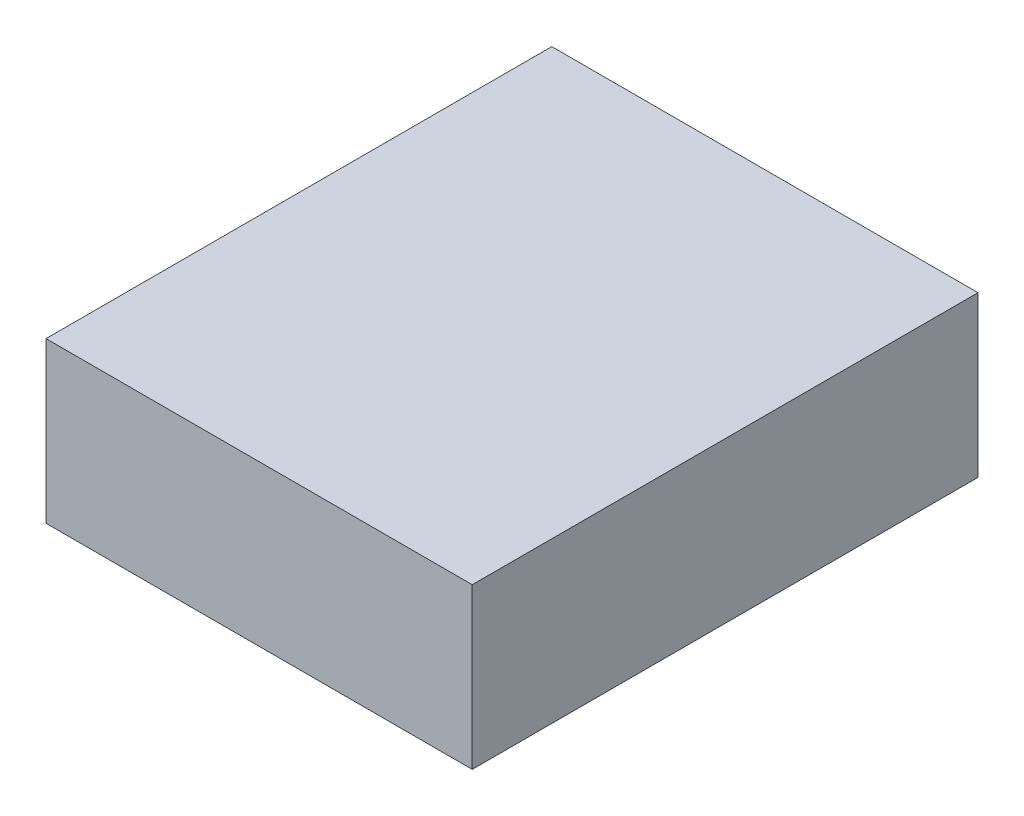
ISO-10303-21;
HEADER;
FILE_DESCRIPTION(('STEP AP214'),'2;1');
FILE_NAME('part.step','',(''),(''),'','','');
FILE_SCHEMA(('AUTOMOTIVE_DESIGN { 1 0 10303 214 1 1 1 1 }'));
ENDSEC;
DATA;
#1=APPLICATION_CONTEXT('core data for automotive mechanical design processes');
#2=APPLICATION_PROTOCOL_DEFINITION('international standard','automotive_design',2000,#1);
#3=PRODUCT_CONTEXT('',#1,'mechanical');
#4=PRODUCT('Part','Part','',(#3));
#5=PRODUCT_RELATED_PRODUCT_CATEGORY('part','',(#4));
#6=PRODUCT_DEFINITION_FORMATION('','',#4);
#7=PRODUCT_DEFINITION_CONTEXT('part definition',#1,'design');
#8=PRODUCT_DEFINITION('design','',#6,#7);
#9=PRODUCT_DEFINITION_SHAPE('','',#8);
#10=(LENGTH_UNIT() NAMED_UNIT(*) SI_UNIT(.MILLI.,.METRE.));
#11=(NAMED_UNIT(*) PLANE_ANGLE_UNIT() SI_UNIT($,.RADIAN.));
#12=(NAMED_UNIT(*) SI_UNIT($,.STERADIAN.) SOLID_ANGLE_UNIT());
#13=UNCERTAINTY_MEASURE_WITH_UNIT(LENGTH_MEASURE(1.E-05),#10,'distance_accuracy_value','');
#14=(GEOMETRIC_REPRESENTATION_CONTEXT(3) GLOBAL_UNCERTAINTY_ASSIGNED_CONTEXT((#13)) GLOBAL_UNIT_ASSIGNED_CONTEXT((#10,
#11,#12)) REPRESENTATION_CONTEXT('',''));
#15=CARTESIAN_POINT('',(0.,0.,0.));
#16=DIRECTION('',(0.,0.,1.));
#17=DIRECTION('',(1.,0.,0.));
#18=AXIS2_PLACEMENT_3D('',#15,#16,#17);
#19=CARTESIAN_POINT('',(-10.4778240280723,-10.,-16.4004969815323));
#20=DIRECTION('',(-1.,0.,0.));
#21=DIRECTION('',(0.,0.,1.));
#22=AXIS2_PLACEMENT_3D('',#19,#20,#21);
#23=PLANE('',#22);
#24=DIRECTION('',(0.,0.,1.));
#25=VECTOR('',#24,1.);
#26=CARTESIAN_POINT('',(-10.4778240280723,0.,-16.4004969815323));
#27=LINE('',#26,#25);
#28=CARTESIAN_POINT('',(-10.4778240280723,0.,-16.4004969815323));
#29=VERTEX_POINT('',#28);
#30=CARTESIAN_POINT('',(-10.4778240280723,0.,15.2189550735784));
#31=VERTEX_POINT('',#30);
#32=EDGE_CURVE('E98',#29,#31,#27,.T.);
#33=ORIENTED_EDGE('',*,*,#32,.F.);
#34=DIRECTION('',(0.,1.,0.));
#35=VECTOR('',#34,1.);
#36=CARTESIAN_POINT('',(-10.4778240280723,-10.,-16.4004969815323));
#37=LINE('',#36,#35);
#38=CARTESIAN_POINT('',(-10.4778240280723,-10.,-16.4004969815323));
#39=VERTEX_POINT('',#38);
#40=EDGE_CURVE('E11',#39,#29,#37,.T.);
#41=ORIENTED_EDGE('',*,*,#40,.F.);
#42=DIRECTION('',(0.,0.,1.));
#43=VECTOR('',#42,1.);
#44=CARTESIAN_POINT('',(-10.4778240280723,-10.,-16.4004969815323));
#45=LINE('',#44,#43);
#46=CARTESIAN_POINT('',(-10.4778240280723,-10.,15.2189550735784));
#47=VERTEX_POINT('',#46);
#48=EDGE_CURVE('E92',#39,#47,#45,.T.);
#49=ORIENTED_EDGE('',*,*,#48,.T.);
#50=DIRECTION('',(0.,1.,0.));
#51=VECTOR('',#50,1.);
#52=CARTESIAN_POINT('',(-10.4778240280723,-10.,15.2189550735784));
#53=LINE('',#52,#51);
#54=EDGE_CURVE('E37',#47,#31,#53,.T.);
#55=ORIENTED_EDGE('',*,*,#54,.T.);
#56=EDGE_LOOP('',(#33,#41,#49,#55));
#57=FACE_BOUND('',#56,.T.);
#58=ADVANCED_FACE('F34',(#57),#23,.T.);
#59=CARTESIAN_POINT('',(-10.4778240280723,-10.,-16.4004969815323));
#60=DIRECTION('',(0.,0.,-1.));
#61=DIRECTION('',(-1.,0.,0.));
#62=AXIS2_PLACEMENT_3D('',#59,#60,#61);
#63=PLANE('',#62);
#64=DIRECTION('',(-1.,0.,0.));
#65=VECTOR('',#64,1.);
#66=CARTESIAN_POINT('',(-10.4778240280723,0.,-16.4004969815323));
#67=LINE('',#66,#65);
#68=CARTESIAN_POINT('',(16.170229898691,0.,-16.4004969815323));
#69=VERTEX_POINT('',#68);
#70=EDGE_CURVE('E94',#69,#29,#67,.T.);
#71=ORIENTED_EDGE('',*,*,#70,.F.);
#72=DIRECTION('',(0.,1.,0.));
#73=VECTOR('',#72,1.);
#74=CARTESIAN_POINT('',(16.170229898691,-10.,-16.4004969815323));
#75=LINE('',#74,#73);
#76=CARTESIAN_POINT('',(16.170229898691,-10.,-16.4004969815323));
#77=VERTEX_POINT('',#76);
#78=EDGE_CURVE('E43',#77,#69,#75,.T.);
#79=ORIENTED_EDGE('',*,*,#78,.F.);
#80=DIRECTION('',(-1.,0.,0.));
#81=VECTOR('',#80,1.);
#82=CARTESIAN_POINT('',(-10.4778240280723,-10.,-16.4004969815323));
#83=LINE('',#82,#81);
#84=EDGE_CURVE('E89',#77,#39,#83,.T.);
#85=ORIENTED_EDGE('',*,*,#84,.T.);
#86=ORIENTED_EDGE('',*,*,#40,.T.);
#87=EDGE_LOOP('',(#71,#79,#85,#86));
#88=FACE_BOUND('',#87,.T.);
#89=ADVANCED_FACE('F108',(#88),#63,.T.);
#90=CARTESIAN_POINT('',(16.170229898691,-10.,-16.4004969815323));
#91=DIRECTION('',(1.,0.,0.));
#92=DIRECTION('',(0.,0.,-1.));
#93=AXIS2_PLACEMENT_3D('',#90,#91,#92);
#94=PLANE('',#93);
#95=DIRECTION('',(0.,0.,-1.));
#96=VECTOR('',#95,1.);
#97=CARTESIAN_POINT('',(16.170229898691,0.,-16.4004969815323));
#98=LINE('',#97,#96);
#99=CARTESIAN_POINT('',(16.170229898691,0.,15.2189550735784));
#100=VERTEX_POINT('',#99);
#101=EDGE_CURVE('E84',#100,#69,#98,.T.);
#102=ORIENTED_EDGE('',*,*,#101,.F.);
#103=DIRECTION('',(0.,1.,0.));
#104=VECTOR('',#103,1.);
#105=CARTESIAN_POINT('',(16.170229898691,-10.,15.2189550735784));
#106=LINE('',#105,#104);
#107=CARTESIAN_POINT('',(16.170229898691,-10.,15.2189550735784));
#108=VERTEX_POINT('',#107);
#109=EDGE_CURVE('E79',#108,#100,#106,.T.);
#110=ORIENTED_EDGE('',*,*,#109,.F.);
#111=DIRECTION('',(0.,0.,-1.));
#112=VECTOR('',#111,1.);
#113=CARTESIAN_POINT('',(16.170229898691,-10.,-16.4004969815323));
#114=LINE('',#113,#112);
#115=EDGE_CURVE('E82',#108,#77,#114,.T.);
#116=ORIENTED_EDGE('',*,*,#115,.T.);
#117=ORIENTED_EDGE('',*,*,#78,.T.);
#118=EDGE_LOOP('',(#102,#110,#116,#117));
#119=FACE_BOUND('',#118,.T.);
#120=ADVANCED_FACE('F81',(#119),#94,.T.);
#121=CARTESIAN_POINT('',(-10.4778240280723,-10.,15.2189550735784));
#122=DIRECTION('',(0.,0.,1.));
#123=DIRECTION('',(1.,0.,0.));
#124=AXIS2_PLACEMENT_3D('',#121,#122,#123);
#125=PLANE('',#124);
#126=DIRECTION('',(1.,0.,0.));
#127=VECTOR('',#126,1.);
#128=CARTESIAN_POINT('',(-10.4778240280723,0.,15.2189550735784));
#129=LINE('',#128,#127);
#130=EDGE_CURVE('E101',#31,#100,#129,.T.);
#131=ORIENTED_EDGE('',*,*,#130,.F.);
#132=ORIENTED_EDGE('',*,*,#54,.F.);
#133=DIRECTION('',(1.,0.,0.));
#134=VECTOR('',#133,1.);
#135=CARTESIAN_POINT('',(-10.4778240280723,-10.,15.2189550735784));
#136=LINE('',#135,#134);
#137=EDGE_CURVE('E88',#47,#108,#136,.T.);
#138=ORIENTED_EDGE('',*,*,#137,.T.);
#139=ORIENTED_EDGE('',*,*,#109,.T.);
#140=EDGE_LOOP('',(#131,#132,#138,#139));
#141=FACE_BOUND('',#140,.T.);
#142=ADVANCED_FACE('F91',(#141),#125,.T.);
#143=CARTESIAN_POINT('',(0.,-10.,0.));
#144=DIRECTION('',(0.,1.,0.));
#145=DIRECTION('',(0.,0.,1.));
#146=AXIS2_PLACEMENT_3D('',#143,#144,#145);
#147=PLANE('',#146);
#148=ORIENTED_EDGE('',*,*,#48,.F.);
#149=ORIENTED_EDGE('',*,*,#84,.F.);
#150=ORIENTED_EDGE('',*,*,#115,.F.);
#151=ORIENTED_EDGE('',*,*,#137,.F.);
#152=EDGE_LOOP('',(#148,#149,#150,#151));
#153=FACE_BOUND('',#152,.T.);
#154=ADVANCED_FACE('F87',(#153),#147,.F.);
#155=CARTESIAN_POINT('',(0.,0.,0.));
#156=DIRECTION('',(0.,1.,0.));
#157=DIRECTION('',(0.,0.,1.));
#158=AXIS2_PLACEMENT_3D('',#155,#156,#157);
#159=PLANE('',#158);
#160=ORIENTED_EDGE('',*,*,#32,.T.);
#161=ORIENTED_EDGE('',*,*,#130,.T.);
#162=ORIENTED_EDGE('',*,*,#101,.T.);
#163=ORIENTED_EDGE('',*,*,#70,.T.);
#164=EDGE_LOOP('',(#160,#161,#162,#163));
#165=FACE_BOUND('',#164,.T.);
#166=ADVANCED_FACE('F107',(#165),#159,.T.);
#167=CLOSED_SHELL('',(#58,#89,#120,#142,#154,#166));
#168=MANIFOLD_SOLID_BREP('B2',#167);
#169=ADVANCED_BREP_SHAPE_REPRESENTATION('',(#18,#168),#14);
#170=SHAPE_DEFINITION_REPRESENTATION(#9,#169);
ENDSEC;
END-ISO-10303-21;
